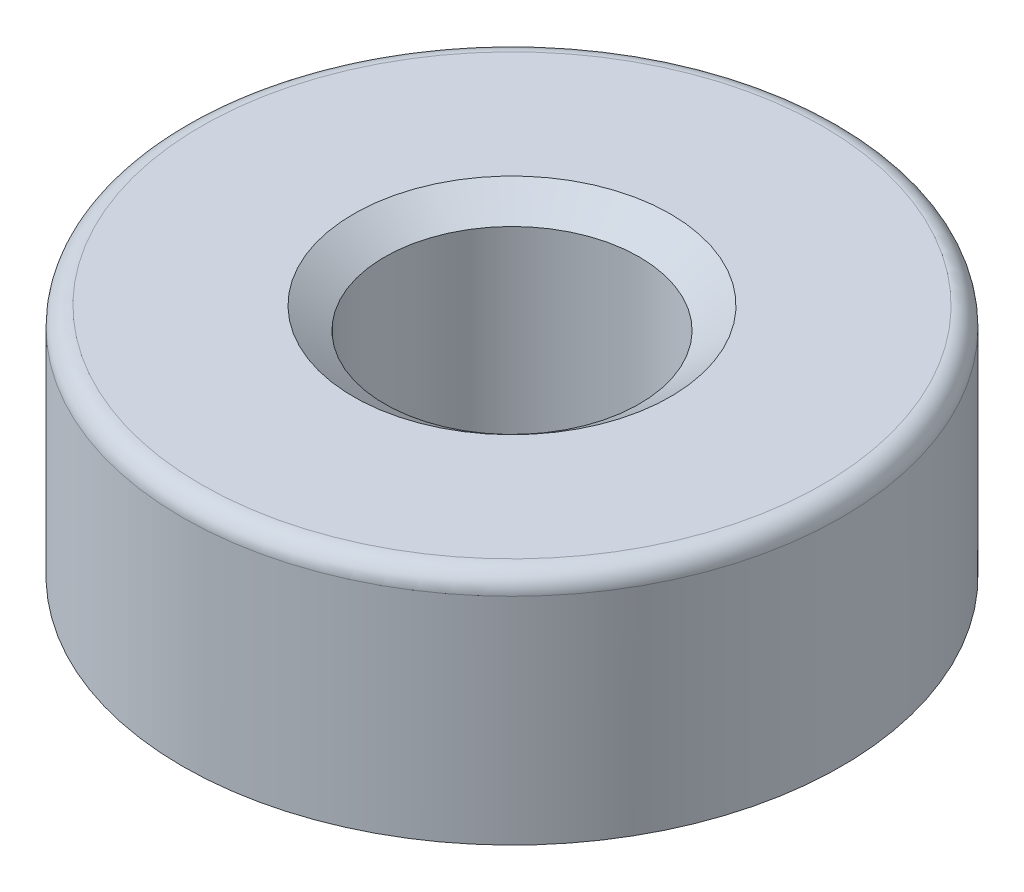
ISO-10303-21;
HEADER;
FILE_DESCRIPTION(('STEP AP214'),'2;1');
FILE_NAME('part.step','',(''),(''),'','','');
FILE_SCHEMA(('AUTOMOTIVE_DESIGN { 1 0 10303 214 1 1 1 1 }'));
ENDSEC;
DATA;
#1=APPLICATION_CONTEXT('core data for automotive mechanical design processes');
#2=APPLICATION_PROTOCOL_DEFINITION('international standard','automotive_design',2000,#1);
#3=PRODUCT_CONTEXT('',#1,'mechanical');
#4=PRODUCT('Part','Part','',(#3));
#5=PRODUCT_RELATED_PRODUCT_CATEGORY('part','',(#4));
#6=PRODUCT_DEFINITION_FORMATION('','',#4);
#7=PRODUCT_DEFINITION_CONTEXT('part definition',#1,'design');
#8=PRODUCT_DEFINITION('design','',#6,#7);
#9=PRODUCT_DEFINITION_SHAPE('','',#8);
#10=(LENGTH_UNIT() NAMED_UNIT(*) SI_UNIT(.MILLI.,.METRE.));
#11=(NAMED_UNIT(*) PLANE_ANGLE_UNIT() SI_UNIT($,.RADIAN.));
#12=(NAMED_UNIT(*) SI_UNIT($,.STERADIAN.) SOLID_ANGLE_UNIT());
#13=UNCERTAINTY_MEASURE_WITH_UNIT(LENGTH_MEASURE(1.E-05),#10,'distance_accuracy_value','');
#14=(GEOMETRIC_REPRESENTATION_CONTEXT(3) GLOBAL_UNCERTAINTY_ASSIGNED_CONTEXT((#13)) GLOBAL_UNIT_ASSIGNED_CONTEXT((#10,
#11,#12)) REPRESENTATION_CONTEXT('',''));
#15=CARTESIAN_POINT('',(0.,0.,0.));
#16=DIRECTION('',(0.,0.,1.));
#17=DIRECTION('',(1.,0.,0.));
#18=AXIS2_PLACEMENT_3D('',#15,#16,#17);
#19=CARTESIAN_POINT('',(0.,-0.6096,0.));
#20=DIRECTION('',(0.,1.,0.));
#21=DIRECTION('',(0.,0.,1.));
#22=AXIS2_PLACEMENT_3D('',#19,#20,#21);
#23=CONICAL_SURFACE('',#22,5.7370345,0.957964637348374);
#24=CARTESIAN_POINT('',(-4.13117819601966,-0.609799999999999,3.9804105306269));
#25=CARTESIAN_POINT('',(-4.20611833556658,-0.50848893755846,4.11021065984846));
#26=CARTESIAN_POINT('',(-4.28099927848266,-0.407003599605015,4.23990825749778));
#27=CARTESIAN_POINT('',(-4.43064275678402,-0.203684392061665,4.49909836493708));
#28=CARTESIAN_POINT('',(-4.50540529219188,-0.10185052253823,4.62859087476616));
#29=CARTESIAN_POINT('',(-4.58010863099149,0.000157622430637075,4.75798085306211));
#30=B_SPLINE_CURVE_WITH_KNOTS('',3,(#24,#25,#26,#27,#28,#29),.UNSPECIFIED.,.F.,.F.,(4,2,4),(0.,
0.542725590338056,1.08545107717376),.UNSPECIFIED.);
#31=CARTESIAN_POINT('',(-4.13132619390401,-0.609599999999999,3.98066687048199));
#32=VERTEX_POINT('',#31);
#33=CARTESIAN_POINT('',(-4.57999316093765,0.,4.75778085306211));
#34=VERTEX_POINT('',#33);
#35=EDGE_CURVE('E268',#32,#34,#30,.T.);
#36=ORIENTED_EDGE('',*,*,#35,.F.);
#37=CARTESIAN_POINT('',(0.,-0.6096,0.));
#38=DIRECTION('',(0.,-1.,0.));
#39=DIRECTION('',(0.,0.,-1.));
#40=AXIS2_PLACEMENT_3D('',#37,#38,#39);
#41=CIRCLE('',#40,5.7370345);
#42=CARTESIAN_POINT('',(-1.38169553688848,-0.6096,5.56816687048195));
#43=VERTEX_POINT('',#42);
#44=EDGE_CURVE('E209',#43,#32,#41,.T.);
#45=ORIENTED_EDGE('',*,*,#44,.F.);
#46=CARTESIAN_POINT('',(-1.83047797397597,0.000157622430635324,6.34548085306206));
#47=CARTESIAN_POINT('',(-1.75577463517636,-0.101850522538232,6.21609087476611));
#48=CARTESIAN_POINT('',(-1.6810120997685,-0.203684392061666,6.08659836493703));
#49=CARTESIAN_POINT('',(-1.53136862146714,-0.407003599605016,5.82740825749774));
#50=CARTESIAN_POINT('',(-1.45648767855105,-0.50848893755846,5.69771065984841));
#51=CARTESIAN_POINT('',(-1.38154753900413,-0.6098,5.56791053062685));
#52=B_SPLINE_CURVE_WITH_KNOTS('',3,(#46,#47,#48,#49,#50,#51),.UNSPECIFIED.,.F.,.F.,(4,2,4),(0.,
0.542725486835704,1.08545107717376),.UNSPECIFIED.);
#53=CARTESIAN_POINT('',(-1.83036250392213,0.,6.34528085306206));
#54=VERTEX_POINT('',#53);
#55=EDGE_CURVE('E183',#54,#43,#52,.T.);
#56=ORIENTED_EDGE('',*,*,#55,.F.);
#57=CARTESIAN_POINT('',(0.,0.,0.));
#58=DIRECTION('',(0.,-1.,0.));
#59=DIRECTION('',(0.,0.,-1.));
#60=AXIS2_PLACEMENT_3D('',#57,#58,#59);
#61=CIRCLE('',#60,6.604);
#62=EDGE_CURVE('E140',#54,#34,#61,.T.);
#63=ORIENTED_EDGE('',*,*,#62,.T.);
#64=EDGE_LOOP('',(#36,#45,#56,#63));
#65=FACE_BOUND('',#64,.T.);
#66=ADVANCED_FACE('F33',(#65),#23,.T.);
#67=CARTESIAN_POINT('',(0.,0.,0.));
#68=DIRECTION('',(0.,-1.,0.));
#69=DIRECTION('',(0.,0.,-1.));
#70=AXIS2_PLACEMENT_3D('',#67,#68,#69);
#71=CONICAL_SURFACE('',#70,4.8674655,0.959374761459782);
#72=CARTESIAN_POINT('',(-3.67535542500938,0.000153044537294077,3.19090233199023));
#73=CARTESIAN_POINT('',(-3.71346949554331,-0.0503643154175214,3.25691783863826));
#74=CARTESIAN_POINT('',(-3.75155322815625,-0.100973127363491,3.32288079846576));
#75=CARTESIAN_POINT('',(-3.8276665504516,-0.202352777514972,3.45471293981417));
#76=CARTESIAN_POINT('',(-3.8656961403259,-0.253123615144149,3.52058212166745));
#77=CARTESIAN_POINT('',(-3.94170795018969,-0.354806757262533,3.65223843832681));
#78=CARTESIAN_POINT('',(-3.97969017021732,-0.405719061637743,3.71802557319892));
#79=CARTESIAN_POINT('',(-4.05561262298329,-0.507669333969212,3.84952711882485));
#80=CARTESIAN_POINT('',(-4.09355285557214,-0.55870730237083,3.91524152931971));
#81=CARTESIAN_POINT('',(-4.13147463561528,-0.609800000000001,3.98092397906788));
#82=B_SPLINE_CURVE_WITH_KNOTS('',3,(#72,#73,#74,#75,#76,#77,#78,#79,#80,#81),.UNSPECIFIED.,.F.,
.F.,(4,2,2,2,4),(0.,0.274343792573355,0.548686610376872,0.823029207175311,1.09737277766191),.UNSPECIFIED.);
#83=CARTESIAN_POINT('',(-3.67547089506321,0.,3.19110233199023));
#84=VERTEX_POINT('',#83);
#85=EDGE_CURVE('E133',#84,#32,#82,.T.);
#86=ORIENTED_EDGE('',*,*,#85,.F.);
#87=CARTESIAN_POINT('',(0.,0.,0.));
#88=DIRECTION('',(0.,-1.,0.));
#89=DIRECTION('',(0.,0.,-1.));
#90=AXIS2_PLACEMENT_3D('',#87,#88,#89);
#91=CIRCLE('',#90,4.8674655);
#92=CARTESIAN_POINT('',(-0.925840238047673,0.,4.77860233199019));
#93=VERTEX_POINT('',#92);
#94=EDGE_CURVE('E214',#93,#84,#91,.T.);
#95=ORIENTED_EDGE('',*,*,#94,.F.);
#96=CARTESIAN_POINT('',(-1.38184397859975,-0.6098,5.56842397906783));
#97=CARTESIAN_POINT('',(-1.34392219855661,-0.558707302370829,5.50274152931966));
#98=CARTESIAN_POINT('',(-1.30598196596776,-0.507669333969211,5.4370271188248));
#99=CARTESIAN_POINT('',(-1.23005951320178,-0.405719061637743,5.30552557319888));
#100=CARTESIAN_POINT('',(-1.19207729317415,-0.354806757262532,5.23973843832676));
#101=CARTESIAN_POINT('',(-1.11606548331036,-0.253123615144149,5.10808212166741));
#102=CARTESIAN_POINT('',(-1.07803589343606,-0.202352777514972,5.04221293981413));
#103=CARTESIAN_POINT('',(-1.00192257114072,-0.100973127363492,4.91038079846572));
#104=CARTESIAN_POINT('',(-0.963838838527767,-0.0503643154175219,4.84441783863822));
#105=CARTESIAN_POINT('',(-0.925724767993835,0.000153044537293294,4.77840233199019));
#106=B_SPLINE_CURVE_WITH_KNOTS('',3,(#96,#97,#98,#99,#100,#101,#102,#103,#104,#105),
.UNSPECIFIED.,.F.,.F.,(4,2,2,2,4),(0.,0.274343570486602,0.54868616728504,0.823028985088557,
1.09737277766191),.UNSPECIFIED.);
#107=EDGE_CURVE('E147',#43,#93,#106,.T.);
#108=ORIENTED_EDGE('',*,*,#107,.F.);
#109=ORIENTED_EDGE('',*,*,#44,.T.);
#110=EDGE_LOOP('',(#86,#95,#108,#109));
#111=FACE_BOUND('',#110,.T.);
#112=ADVANCED_FACE('F242',(#111),#71,.F.);
#113=CARTESIAN_POINT('',(-4.58010863099155,0.000157622430634788,-4.75798085306204));
#114=CARTESIAN_POINT('',(-4.50540529219194,-0.101850522538232,-4.6285908747661));
#115=CARTESIAN_POINT('',(-4.43064275678408,-0.203684392061667,-4.49909836493702));
#116=CARTESIAN_POINT('',(-4.28099927848272,-0.407003599605016,-4.23990825749772));
#117=CARTESIAN_POINT('',(-4.20611833556663,-0.50848893755846,-4.1102106598484));
#118=CARTESIAN_POINT('',(-4.13117819601972,-0.609799999999999,-3.98041053062684));
#119=B_SPLINE_CURVE_WITH_KNOTS('',3,(#113,#114,#115,#116,#117,#118),.UNSPECIFIED.,.F.,.F.,(4,2,
4),(0.,0.542725486835703,1.08545107717376),.UNSPECIFIED.);
#120=CARTESIAN_POINT('',(-4.57999316093771,0.,-4.75778085306204));
#121=VERTEX_POINT('',#120);
#122=CARTESIAN_POINT('',(-4.13132619390406,-0.6096,-3.98066687048194));
#123=VERTEX_POINT('',#122);
#124=EDGE_CURVE('E121',#121,#123,#119,.T.);
#125=ORIENTED_EDGE('',*,*,#124,.F.);
#126=CARTESIAN_POINT('',(-1.83036250392213,0.,-6.34528085306206));
#127=VERTEX_POINT('',#126);
#128=EDGE_CURVE('E130',#121,#127,#61,.T.);
#129=ORIENTED_EDGE('',*,*,#128,.T.);
#130=CARTESIAN_POINT('',(-1.38154753900413,-0.6098,-5.56791053062685));
#131=CARTESIAN_POINT('',(-1.45648767855105,-0.50848893755846,-5.69771065984841));
#132=CARTESIAN_POINT('',(-1.53136862146714,-0.407003599605016,-5.82740825749774));
#133=CARTESIAN_POINT('',(-1.6810120997685,-0.203684392061665,-6.08659836493703));
#134=CARTESIAN_POINT('',(-1.75577463517636,-0.101850522538231,-6.21609087476611));
#135=CARTESIAN_POINT('',(-1.83047797397597,0.000157622430637036,-6.34548085306206));
#136=B_SPLINE_CURVE_WITH_KNOTS('',3,(#130,#131,#132,#133,#134,#135),.UNSPECIFIED.,.F.,.F.,(4,2,
4),(0.,0.542725590338057,1.08545107717376),.UNSPECIFIED.);
#137=CARTESIAN_POINT('',(-1.38169553688848,-0.6096,-5.56816687048195));
#138=VERTEX_POINT('',#137);
#139=EDGE_CURVE('E263',#138,#127,#136,.T.);
#140=ORIENTED_EDGE('',*,*,#139,.F.);
#141=EDGE_CURVE('E132',#123,#138,#41,.T.);
#142=ORIENTED_EDGE('',*,*,#141,.F.);
#143=EDGE_LOOP('',(#125,#129,#140,#142));
#144=FACE_BOUND('',#143,.T.);
#145=ADVANCED_FACE('F128',(#144),#23,.T.);
#146=CARTESIAN_POINT('',(-4.13147463561533,-0.6098,-3.98092397906782));
#147=CARTESIAN_POINT('',(-4.09355285557219,-0.558707302370829,-3.91524152931965));
#148=CARTESIAN_POINT('',(-4.05561262298335,-0.507669333969211,-3.84952711882479));
#149=CARTESIAN_POINT('',(-3.97969017021737,-0.405719061637743,-3.71802557319887));
#150=CARTESIAN_POINT('',(-3.94170795018974,-0.354806757262532,-3.65223843832675));
#151=CARTESIAN_POINT('',(-3.86569614032594,-0.253123615144149,-3.5205821216674));
#152=CARTESIAN_POINT('',(-3.82766655045165,-0.202352777514972,-3.45471293981411));
#153=CARTESIAN_POINT('',(-3.7515532281563,-0.100973127363491,-3.3228807984657));
#154=CARTESIAN_POINT('',(-3.71346949554335,-0.0503643154175213,-3.25691783863821));
#155=CARTESIAN_POINT('',(-3.67535542500942,0.000153044537294263,-3.19090233199018));
#156=B_SPLINE_CURVE_WITH_KNOTS('',3,(#146,#147,#148,#149,#150,#151,#152,#153,#154,#155),
.UNSPECIFIED.,.F.,.F.,(4,2,2,2,4),(0.,0.274343570486603,0.548686167285041,0.823028985088558,
1.09737277766191),.UNSPECIFIED.);
#157=CARTESIAN_POINT('',(-3.67547089506326,0.,-3.19110233199018));
#158=VERTEX_POINT('',#157);
#159=EDGE_CURVE('E123',#123,#158,#156,.T.);
#160=ORIENTED_EDGE('',*,*,#159,.F.);
#161=ORIENTED_EDGE('',*,*,#141,.T.);
#162=CARTESIAN_POINT('',(-0.925724767993835,0.000153044537293486,-4.77840233199019));
#163=CARTESIAN_POINT('',(-0.963838838527767,-0.0503643154175216,-4.84441783863822));
#164=CARTESIAN_POINT('',(-1.00192257114071,-0.100973127363491,-4.91038079846572));
#165=CARTESIAN_POINT('',(-1.07803589343606,-0.202352777514972,-5.04221293981412));
#166=CARTESIAN_POINT('',(-1.11606548331036,-0.253123615144149,-5.10808212166741));
#167=CARTESIAN_POINT('',(-1.19207729317415,-0.354806757262532,-5.23973843832676));
#168=CARTESIAN_POINT('',(-1.23005951320178,-0.405719061637743,-5.30552557319888));
#169=CARTESIAN_POINT('',(-1.30598196596776,-0.507669333969211,-5.4370271188248));
#170=CARTESIAN_POINT('',(-1.34392219855661,-0.558707302370829,-5.50274152931966));
#171=CARTESIAN_POINT('',(-1.38184397859975,-0.6098,-5.56842397906783));
#172=B_SPLINE_CURVE_WITH_KNOTS('',3,(#162,#163,#164,#165,#166,#167,#168,#169,#170,#171),
.UNSPECIFIED.,.F.,.F.,(4,2,2,2,4),(0.,0.274343792573353,0.54868661037687,0.823029207175308,
1.09737277766191),.UNSPECIFIED.);
#173=CARTESIAN_POINT('',(-0.925840238047673,0.,-4.77860233199019));
#174=VERTEX_POINT('',#173);
#175=EDGE_CURVE('E12',#174,#138,#172,.T.);
#176=ORIENTED_EDGE('',*,*,#175,.F.);
#177=EDGE_CURVE('E217',#158,#174,#91,.T.);
#178=ORIENTED_EDGE('',*,*,#177,.F.);
#179=EDGE_LOOP('',(#160,#161,#176,#178));
#180=FACE_BOUND('',#179,.T.);
#181=ADVANCED_FACE('F248',(#180),#71,.F.);
#182=CARTESIAN_POINT('',(8.88359413195526,1.70183097655833,-1.5875));
#183=CARTESIAN_POINT('',(8.62766235007396,1.52469212498835,-1.5875));
#184=CARTESIAN_POINT('',(8.37162948069224,1.34769885013557,-1.5875));
#185=CARTESIAN_POINT('',(7.85927634395191,0.994136258998819,-1.5875));
#186=CARTESIAN_POINT('',(7.60295608052589,0.817566937015043,-1.5875));
#187=CARTESIAN_POINT('',(7.08997105135558,0.465004338070332,-1.5875));
#188=CARTESIAN_POINT('',(6.83330633744547,0.289010985726122,-1.5875));
#189=CARTESIAN_POINT('',(6.31945101554129,-0.0622159179651071,-1.5875));
#190=CARTESIAN_POINT('',(6.0622603991041,-0.237449456970467,-1.5875));
#191=CARTESIAN_POINT('',(5.54708808050595,-0.586858049222113,-1.5875));
#192=CARTESIAN_POINT('',(5.2891062349854,-0.761032891229834,-1.5875));
#193=CARTESIAN_POINT('',(4.77205723985228,-1.10774785422472,-1.5875));
#194=CARTESIAN_POINT('',(4.51299013197585,-1.2802880372589,-1.5875));
#195=CARTESIAN_POINT('',(4.12306667969058,-1.53714244357691,-1.5875));
#196=CARTESIAN_POINT('',(3.9928600242795,-1.62244214357263,-1.5875));
#197=CARTESIAN_POINT('',(3.73188216948657,-1.79216931768247,-1.5875));
#198=CARTESIAN_POINT('',(3.60111097963224,-1.87659680643574,-1.5875));
#199=CARTESIAN_POINT('',(3.33881666890665,-2.04431754192365,-1.5875));
#200=CARTESIAN_POINT('',(3.20729345266764,-2.12761064005899,-1.5875));
#201=CARTESIAN_POINT('',(2.94322406483998,-2.29257431796486,-1.5875));
#202=CARTESIAN_POINT('',(2.81067783395692,-2.37424480269237,-1.5875));
#203=CARTESIAN_POINT('',(2.67748382748673,-2.45486052485991,-1.5875));
#204=B_SPLINE_CURVE_WITH_KNOTS('',3,(#182,#183,#184,#185,#186,#187,#188,#189,#190,#191,#192,
#193,#194,#195,#196,#197,#198,#199,#200,#201,#202,#203),.UNSPECIFIED.,.F.,.F.,(4,2,2,2,2,2,2,2,
2,2,4),(0.,0.933763312908904,1.86751400081132,2.80113715565333,3.73477541896571,
4.66859422558676,5.60237744393722,6.06935260293879,6.53631991147511,7.00334781307664,
7.47040299021021),.UNSPECIFIED.);
#205=CARTESIAN_POINT('',(6.41035566485979,0.,-1.5875));
#206=VERTEX_POINT('',#205);
#207=CARTESIAN_POINT('',(5.51302173079249,-0.6096,-1.5875));
#208=VERTEX_POINT('',#207);
#209=EDGE_CURVE('E259',#206,#208,#204,.T.);
#210=ORIENTED_EDGE('',*,*,#209,.F.);
#211=CARTESIAN_POINT('',(6.41035566485979,0.,1.5875));
#212=VERTEX_POINT('',#211);
#213=EDGE_CURVE('E141',#206,#212,#61,.T.);
#214=ORIENTED_EDGE('',*,*,#213,.T.);
#215=CARTESIAN_POINT('',(2.67748382748673,-2.45486052485992,1.5875));
#216=CARTESIAN_POINT('',(2.81067783395692,-2.37424480269237,1.5875));
#217=CARTESIAN_POINT('',(2.94322406483998,-2.29257431796486,1.5875));
#218=CARTESIAN_POINT('',(3.20729345266764,-2.12761064005899,1.5875));
#219=CARTESIAN_POINT('',(3.33881666890665,-2.04431754192365,1.5875));
#220=CARTESIAN_POINT('',(3.60111097963224,-1.87659680643574,1.5875));
#221=CARTESIAN_POINT('',(3.73188216948657,-1.79216931768247,1.5875));
#222=CARTESIAN_POINT('',(3.9928600242795,-1.62244214357263,1.5875));
#223=CARTESIAN_POINT('',(4.12306667969058,-1.53714244357691,1.5875));
#224=CARTESIAN_POINT('',(4.51299013197585,-1.2802880372589,1.5875));
#225=CARTESIAN_POINT('',(4.77205723985229,-1.10774785422472,1.5875));
#226=CARTESIAN_POINT('',(5.28910623498541,-0.761032891229833,1.5875));
#227=CARTESIAN_POINT('',(5.54708808050595,-0.586858049222112,1.5875));
#228=CARTESIAN_POINT('',(6.0622603991041,-0.237449456970466,1.5875));
#229=CARTESIAN_POINT('',(6.31945101554129,-0.0622159179651071,1.5875));
#230=CARTESIAN_POINT('',(6.83330633744547,0.289010985726122,1.5875));
#231=CARTESIAN_POINT('',(7.08997105135558,0.465004338070332,1.5875));
#232=CARTESIAN_POINT('',(7.60295608052589,0.817566937015044,1.5875));
#233=CARTESIAN_POINT('',(7.85927634395191,0.99413625899882,1.5875));
#234=CARTESIAN_POINT('',(8.37162948069224,1.34769885013557,1.5875));
#235=CARTESIAN_POINT('',(8.62766235007396,1.52469212498835,1.5875));
#236=CARTESIAN_POINT('',(8.88359413195526,1.70183097655833,1.5875));
#237=B_SPLINE_CURVE_WITH_KNOTS('',3,(#215,#216,#217,#218,#219,#220,#221,#222,#223,#224,#225,
#226,#227,#228,#229,#230,#231,#232,#233,#234,#235,#236),.UNSPECIFIED.,.F.,.F.,(4,2,2,2,2,2,2,2,
2,2,4),(0.,0.467055177133574,0.934083078735098,1.40105038727142,1.868025546273,2.80180876462346,
3.73562757124451,4.66926583455689,5.60288898939889,6.53663967730131,7.47040299021021),.UNSPECIFIED.);
#238=CARTESIAN_POINT('',(5.51302173079249,-0.6096,1.5875));
#239=VERTEX_POINT('',#238);
#240=EDGE_CURVE('E189',#239,#212,#237,.T.);
#241=ORIENTED_EDGE('',*,*,#240,.F.);
#242=EDGE_CURVE('E213',#208,#239,#41,.T.);
#243=ORIENTED_EDGE('',*,*,#242,.F.);
#244=EDGE_LOOP('',(#210,#214,#241,#243));
#245=FACE_BOUND('',#244,.T.);
#246=ADVANCED_FACE('F35',(#245),#23,.T.);
#247=CARTESIAN_POINT('',(0.,0.,0.));
#248=DIRECTION('',(0.,-1.,0.));
#249=DIRECTION('',(0.,0.,-1.));
#250=AXIS2_PLACEMENT_3D('',#247,#248,#249);
#251=CYLINDRICAL_SURFACE('',#250,6.604);
#252=CARTESIAN_POINT('',(0.,4.318,0.));
#253=DIRECTION('',(0.,-1.,0.));
#254=DIRECTION('',(0.,0.,-1.));
#255=AXIS2_PLACEMENT_3D('',#252,#253,#254);
#256=CIRCLE('',#255,6.604);
#257=CARTESIAN_POINT('',(0.,4.318,-6.604));
#258=VERTEX_POINT('',#257);
#259=EDGE_CURVE('E144',#258,#258,#256,.T.);
#260=ORIENTED_EDGE('',*,*,#259,.T.);
#261=EDGE_LOOP('',(#260));
#262=FACE_BOUND('',#261,.T.);
#263=EDGE_CURVE('E143',#212,#54,#61,.T.);
#264=ORIENTED_EDGE('',*,*,#263,.F.);
#265=ORIENTED_EDGE('',*,*,#213,.F.);
#266=CARTESIAN_POINT('',(0.,0.,0.));
#267=DIRECTION('',(0.,1.,0.));
#268=DIRECTION('',(0.866025403784436,0.,-0.500000000000004));
#269=AXIS2_PLACEMENT_3D('',#266,#267,#268);
#270=CIRCLE('',#269,6.604);
#271=EDGE_CURVE('E139',#206,#127,#270,.T.);
#272=ORIENTED_EDGE('',*,*,#271,.T.);
#273=ORIENTED_EDGE('',*,*,#128,.F.);
#274=CARTESIAN_POINT('',(0.,0.,0.));
#275=DIRECTION('',(0.,1.,0.));
#276=DIRECTION('',(-0.866025403784443,0.,-0.499999999999992));
#277=AXIS2_PLACEMENT_3D('',#274,#275,#276);
#278=CIRCLE('',#277,6.604);
#279=EDGE_CURVE('E108',#121,#34,#278,.T.);
#280=ORIENTED_EDGE('',*,*,#279,.T.);
#281=ORIENTED_EDGE('',*,*,#62,.F.);
#282=EDGE_LOOP('',(#264,#265,#272,#273,#280,#281));
#283=FACE_BOUND('',#282,.T.);
#284=ADVANCED_FACE('F137',(#262,#283),#251,.T.);
#285=CARTESIAN_POINT('',(0.,4.318,0.));
#286=DIRECTION('',(0.,-1.,0.));
#287=DIRECTION('',(0.,0.,-1.));
#288=AXIS2_PLACEMENT_3D('',#285,#286,#287);
#289=TOROIDAL_SURFACE('',#288,6.223,0.381);
#290=CARTESIAN_POINT('',(0.,4.699,0.));
#291=DIRECTION('',(0.,-1.,0.));
#292=DIRECTION('',(0.,0.,-1.));
#293=AXIS2_PLACEMENT_3D('',#290,#291,#292);
#294=CIRCLE('',#293,6.223);
#295=CARTESIAN_POINT('',(0.,4.699,-6.223));
#296=VERTEX_POINT('',#295);
#297=EDGE_CURVE('E223',#296,#296,#294,.T.);
#298=ORIENTED_EDGE('',*,*,#297,.T.);
#299=EDGE_LOOP('',(#298));
#300=FACE_BOUND('',#299,.T.);
#301=ORIENTED_EDGE('',*,*,#259,.F.);
#302=EDGE_LOOP('',(#301));
#303=FACE_BOUND('',#302,.T.);
#304=ADVANCED_FACE('F229',(#300,#303),#289,.T.);
#305=CARTESIAN_POINT('',(6.223,4.699,0.));
#306=DIRECTION('',(0.,1.,0.));
#307=DIRECTION('',(0.,0.,1.));
#308=AXIS2_PLACEMENT_3D('',#305,#306,#307);
#309=PLANE('',#308);
#310=CARTESIAN_POINT('',(0.,4.699,0.));
#311=DIRECTION('',(0.,-1.,0.));
#312=DIRECTION('',(0.,0.,-1.));
#313=AXIS2_PLACEMENT_3D('',#310,#311,#312);
#314=CIRCLE('',#313,3.175);
#315=CARTESIAN_POINT('',(0.,4.699,-3.175));
#316=VERTEX_POINT('',#315);
#317=EDGE_CURVE('E200',#316,#316,#314,.T.);
#318=ORIENTED_EDGE('',*,*,#317,.T.);
#319=EDGE_LOOP('',(#318));
#320=FACE_BOUND('',#319,.T.);
#321=ORIENTED_EDGE('',*,*,#297,.F.);
#322=EDGE_LOOP('',(#321));
#323=FACE_BOUND('',#322,.T.);
#324=ADVANCED_FACE('F231',(#320,#323),#309,.T.);
#325=CARTESIAN_POINT('',(0.,0.,0.));
#326=DIRECTION('',(0.,-1.,0.));
#327=DIRECTION('',(0.,0.,-1.));
#328=AXIS2_PLACEMENT_3D('',#325,#326,#327);
#329=CYLINDRICAL_SURFACE('',#328,2.5527);
#330=CARTESIAN_POINT('',(0.,4.26342269239784,0.));
#331=DIRECTION('',(0.,-1.,0.));
#332=DIRECTION('',(0.,0.,-1.));
#333=AXIS2_PLACEMENT_3D('',#330,#331,#332);
#334=CIRCLE('',#333,2.5527);
#335=CARTESIAN_POINT('',(0.,4.26342269239784,-2.5527));
#336=VERTEX_POINT('',#335);
#337=EDGE_CURVE('E197',#336,#336,#334,.T.);
#338=ORIENTED_EDGE('',*,*,#337,.F.);
#339=EDGE_LOOP('',(#338));
#340=FACE_BOUND('',#339,.T.);
#341=CARTESIAN_POINT('',(0.,-0.52962269239784,0.));
#342=DIRECTION('',(0.,-1.,0.));
#343=DIRECTION('',(0.,0.,-1.));
#344=AXIS2_PLACEMENT_3D('',#341,#342,#343);
#345=CIRCLE('',#344,2.5527);
#346=CARTESIAN_POINT('',(0.,-0.52962269239784,-2.5527));
#347=VERTEX_POINT('',#346);
#348=EDGE_CURVE('E203',#347,#347,#345,.T.);
#349=ORIENTED_EDGE('',*,*,#348,.T.);
#350=EDGE_LOOP('',(#349));
#351=FACE_BOUND('',#350,.T.);
#352=ADVANCED_FACE('F238',(#340,#351),#329,.F.);
#353=CARTESIAN_POINT('',(2.5527,-1.2192,0.));
#354=DIRECTION('',(0.,-1.,0.));
#355=DIRECTION('',(0.,0.,-1.));
#356=AXIS2_PLACEMENT_3D('',#353,#354,#355);
#357=PLANE('',#356);
#358=CARTESIAN_POINT('',(0.,-1.2192,0.));
#359=DIRECTION('',(0.,-1.,0.));
#360=DIRECTION('',(0.,0.,-1.));
#361=AXIS2_PLACEMENT_3D('',#358,#359,#360);
#362=CIRCLE('',#361,3.175);
#363=CARTESIAN_POINT('',(0.,-1.2192,-3.175));
#364=VERTEX_POINT('',#363);
#365=EDGE_CURVE('E162',#364,#364,#362,.T.);
#366=ORIENTED_EDGE('',*,*,#365,.F.);
#367=EDGE_LOOP('',(#366));
#368=FACE_BOUND('',#367,.T.);
#369=CARTESIAN_POINT('',(0.,-1.2192,0.));
#370=DIRECTION('',(0.,-1.,0.));
#371=DIRECTION('',(0.,0.,-1.));
#372=AXIS2_PLACEMENT_3D('',#369,#370,#371);
#373=CIRCLE('',#372,4.0005);
#374=CARTESIAN_POINT('',(0.,-1.2192,-4.0005));
#375=VERTEX_POINT('',#374);
#376=EDGE_CURVE('E220',#375,#375,#373,.T.);
#377=ORIENTED_EDGE('',*,*,#376,.T.);
#378=EDGE_LOOP('',(#377));
#379=FACE_BOUND('',#378,.T.);
#380=ADVANCED_FACE('F307',(#368,#379),#357,.T.);
#381=CARTESIAN_POINT('',(0.,0.,0.));
#382=DIRECTION('',(0.,-1.,0.));
#383=DIRECTION('',(0.,0.,-1.));
#384=AXIS2_PLACEMENT_3D('',#381,#382,#383);
#385=CYLINDRICAL_SURFACE('',#384,4.0005);
#386=CARTESIAN_POINT('',(0.,0.,0.));
#387=DIRECTION('',(0.,-1.,0.));
#388=DIRECTION('',(0.,0.,-1.));
#389=AXIS2_PLACEMENT_3D('',#386,#387,#388);
#390=CIRCLE('',#389,4.0005);
#391=CARTESIAN_POINT('',(0.,0.,-4.0005));
#392=VERTEX_POINT('',#391);
#393=EDGE_CURVE('E216',#392,#392,#390,.T.);
#394=ORIENTED_EDGE('',*,*,#393,.T.);
#395=EDGE_LOOP('',(#394));
#396=FACE_BOUND('',#395,.T.);
#397=ORIENTED_EDGE('',*,*,#376,.F.);
#398=EDGE_LOOP('',(#397));
#399=FACE_BOUND('',#398,.T.);
#400=ADVANCED_FACE('F310',(#396,#399),#385,.T.);
#401=CARTESIAN_POINT('',(4.0005,0.,0.));
#402=DIRECTION('',(0.,-1.,0.));
#403=DIRECTION('',(0.,0.,-1.));
#404=AXIS2_PLACEMENT_3D('',#401,#402,#403);
#405=PLANE('',#404);
#406=ORIENTED_EDGE('',*,*,#94,.T.);
#407=DIRECTION('',(0.499999999999992,0.,-0.866025403784443));
#408=VECTOR('',#407,1.);
#409=CARTESIAN_POINT('',(-3.67547089506321,0.,3.19110233199023));
#410=LINE('',#409,#408);
#411=EDGE_CURVE('E112',#34,#84,#410,.T.);
#412=ORIENTED_EDGE('',*,*,#411,.F.);
#413=ORIENTED_EDGE('',*,*,#279,.F.);
#414=DIRECTION('',(-0.500000000000004,0.,-0.866025403784436));
#415=VECTOR('',#414,1.);
#416=CARTESIAN_POINT('',(-3.67547089506326,0.,-3.19110233199018));
#417=LINE('',#416,#415);
#418=EDGE_CURVE('E54',#158,#121,#417,.T.);
#419=ORIENTED_EDGE('',*,*,#418,.F.);
#420=ORIENTED_EDGE('',*,*,#177,.T.);
#421=DIRECTION('',(0.500000000000004,0.,0.866025403784436));
#422=VECTOR('',#421,1.);
#423=CARTESIAN_POINT('',(-0.925840238047673,0.,-4.77860233199019));
#424=LINE('',#423,#422);
#425=EDGE_CURVE('E264',#127,#174,#424,.T.);
#426=ORIENTED_EDGE('',*,*,#425,.F.);
#427=ORIENTED_EDGE('',*,*,#271,.F.);
#428=DIRECTION('',(1.,0.,0.));
#429=VECTOR('',#428,1.);
#430=CARTESIAN_POINT('',(4.60131113311089,0.,-1.5875));
#431=LINE('',#430,#429);
#432=CARTESIAN_POINT('',(4.60131113311089,0.,-1.5875));
#433=VERTEX_POINT('',#432);
#434=EDGE_CURVE('E61',#433,#206,#431,.T.);
#435=ORIENTED_EDGE('',*,*,#434,.F.);
#436=CARTESIAN_POINT('',(4.60131113311089,0.,1.5875));
#437=VERTEX_POINT('',#436);
#438=EDGE_CURVE('E212',#433,#437,#91,.T.);
#439=ORIENTED_EDGE('',*,*,#438,.T.);
#440=DIRECTION('',(-1.,0.,0.));
#441=VECTOR('',#440,1.);
#442=CARTESIAN_POINT('',(4.60131113311089,0.,1.5875));
#443=LINE('',#442,#441);
#444=EDGE_CURVE('E190',#212,#437,#443,.T.);
#445=ORIENTED_EDGE('',*,*,#444,.F.);
#446=ORIENTED_EDGE('',*,*,#263,.T.);
#447=DIRECTION('',(-0.500000000000004,0.,0.866025403784436));
#448=VECTOR('',#447,1.);
#449=CARTESIAN_POINT('',(-0.925840238047673,0.,4.77860233199019));
#450=LINE('',#449,#448);
#451=EDGE_CURVE('E269',#93,#54,#450,.T.);
#452=ORIENTED_EDGE('',*,*,#451,.F.);
#453=EDGE_LOOP('',(#406,#412,#413,#419,#420,#426,#427,#435,#439,#445,#446,#452));
#454=FACE_BOUND('',#453,.T.);
#455=ORIENTED_EDGE('',*,*,#393,.F.);
#456=EDGE_LOOP('',(#455));
#457=FACE_BOUND('',#456,.T.);
#458=ADVANCED_FACE('F110',(#454,#457),#405,.T.);
#459=CARTESIAN_POINT('',(7.21485407767053,-1.7665955167632,-1.5875));
#460=CARTESIAN_POINT('',(7.03974524876197,-1.64671176503557,-1.5875));
#461=CARTESIAN_POINT('',(6.86454774778282,-1.5269571696154,-1.5875));
#462=CARTESIAN_POINT('',(6.51391694349854,-1.28779133053037,-1.5875));
#463=CARTESIAN_POINT('',(6.33848363869295,-1.16838008906566,-1.5875));
#464=CARTESIAN_POINT('',(5.98734282383478,-0.92999962809926,-1.5875));
#465=CARTESIAN_POINT('',(5.81163534341483,-0.811030364971397,-1.5875));
#466=CARTESIAN_POINT('',(5.45984461983842,-0.573649364322018,-1.5875));
#467=CARTESIAN_POINT('',(5.28376137762757,-0.455237625399887,-1.5875));
#468=CARTESIAN_POINT('',(4.9310810019884,-0.21913688560499,-1.5875));
#469=CARTESIAN_POINT('',(4.75448381143613,-0.101447969975989,-1.5875));
#470=CARTESIAN_POINT('',(4.4006274843647,0.132924997282341,-1.5875));
#471=CARTESIAN_POINT('',(4.22336835885226,0.24960906551466,-1.5875));
#472=CARTESIAN_POINT('',(3.86791031163845,0.481582514859256,-1.5875));
#473=CARTESIAN_POINT('',(3.68971129247786,0.596871747087129,-1.5875));
#474=CARTESIAN_POINT('',(3.42141228370587,0.76825142627634,-1.5875));
#475=CARTESIAN_POINT('',(3.33181003975289,0.825120510636639,-1.5875));
#476=CARTESIAN_POINT('',(3.15219233234619,0.938205499756766,-1.5875));
#477=CARTESIAN_POINT('',(3.06217686163531,0.994421392983455,-1.5875));
#478=CARTESIAN_POINT('',(2.97191568508043,1.05024267880496,-1.5875));
#479=B_SPLINE_CURVE_WITH_KNOTS('',3,(#459,#460,#461,#462,#463,#464,#465,#466,#467,#468,#469,
#470,#471,#472,#473,#474,#475,#476,#477,#478),.UNSPECIFIED.,.F.,.F.,(4,2,2,2,2,2,2,2,2,4),(0.,
0.636645317122332,1.27329470469245,1.90987948583049,2.54646266688254,3.18311953273302,
3.81976585890572,4.45647955140419,4.77485402560561,5.0932341127037),.UNSPECIFIED.);
#480=EDGE_CURVE('E47',#208,#433,#479,.T.);
#481=ORIENTED_EDGE('',*,*,#480,.F.);
#482=ORIENTED_EDGE('',*,*,#242,.T.);
#483=CARTESIAN_POINT('',(2.97191568508042,1.05024267880496,1.5875));
#484=CARTESIAN_POINT('',(3.06217686163531,0.994421392983458,1.5875));
#485=CARTESIAN_POINT('',(3.15219233234619,0.938205499756769,1.5875));
#486=CARTESIAN_POINT('',(3.33181003975289,0.825120510636642,1.5875));
#487=CARTESIAN_POINT('',(3.42141228370587,0.768251426276342,1.5875));
#488=CARTESIAN_POINT('',(3.68971129247785,0.596871747087131,1.5875));
#489=CARTESIAN_POINT('',(3.86791031163845,0.48158251485926,1.5875));
#490=CARTESIAN_POINT('',(4.22336835885226,0.249609065514661,1.5875));
#491=CARTESIAN_POINT('',(4.40062748436469,0.132924997282337,1.5875));
#492=CARTESIAN_POINT('',(4.75448381143613,-0.101447969975982,1.5875));
#493=CARTESIAN_POINT('',(4.93108100198841,-0.219136885604969,1.5875));
#494=CARTESIAN_POINT('',(5.28376137762758,-0.455237625399867,1.5875));
#495=CARTESIAN_POINT('',(5.45984461983842,-0.573649364322012,1.5875));
#496=CARTESIAN_POINT('',(5.81163534341482,-0.811030364971402,1.5875));
#497=CARTESIAN_POINT('',(5.98734282383478,-0.929999628099262,1.5875));
#498=CARTESIAN_POINT('',(6.33848363869295,-1.16838008906566,1.5875));
#499=CARTESIAN_POINT('',(6.51391694349854,-1.28779133053037,1.5875));
#500=CARTESIAN_POINT('',(6.86454774778282,-1.5269571696154,1.5875));
#501=CARTESIAN_POINT('',(7.03974524876197,-1.64671176503557,1.5875));
#502=CARTESIAN_POINT('',(7.21485407767053,-1.7665955167632,1.5875));
#503=B_SPLINE_CURVE_WITH_KNOTS('',3,(#483,#484,#485,#486,#487,#488,#489,#490,#491,#492,#493,
#494,#495,#496,#497,#498,#499,#500,#501,#502),.UNSPECIFIED.,.F.,.F.,(4,2,2,2,2,2,2,2,2,4),(0.,
0.318380087098087,0.636754561299508,1.27346825379798,1.91011457997068,2.54677144582116,
3.18335462687321,3.81993940801125,4.45658879558137,5.0932341127037),.UNSPECIFIED.);
#504=EDGE_CURVE('E151',#437,#239,#503,.T.);
#505=ORIENTED_EDGE('',*,*,#504,.F.);
#506=ORIENTED_EDGE('',*,*,#438,.F.);
#507=EDGE_LOOP('',(#481,#482,#505,#506));
#508=FACE_BOUND('',#507,.T.);
#509=ADVANCED_FACE('F167',(#508),#71,.F.);
#510=CARTESIAN_POINT('',(0.,-2.54,0.));
#511=DIRECTION('',(0.,-1.,0.));
#512=DIRECTION('',(0.,0.,-1.));
#513=AXIS2_PLACEMENT_3D('',#510,#511,#512);
#514=CYLINDRICAL_SURFACE('',#513,3.175);
#515=ORIENTED_EDGE('',*,*,#365,.T.);
#516=EDGE_LOOP('',(#515));
#517=FACE_BOUND('',#516,.T.);
#518=CARTESIAN_POINT('',(0.,-0.9652,0.));
#519=DIRECTION('',(0.,-1.,0.));
#520=DIRECTION('',(0.,0.,-1.));
#521=AXIS2_PLACEMENT_3D('',#518,#519,#520);
#522=CIRCLE('',#521,3.175);
#523=CARTESIAN_POINT('',(0.,-0.9652,-3.175));
#524=VERTEX_POINT('',#523);
#525=EDGE_CURVE('E206',#524,#524,#522,.T.);
#526=ORIENTED_EDGE('',*,*,#525,.F.);
#527=EDGE_LOOP('',(#526));
#528=FACE_BOUND('',#527,.T.);
#529=ADVANCED_FACE('F304',(#517,#528),#514,.F.);
#530=CARTESIAN_POINT('',(0.,-0.9652,0.));
#531=DIRECTION('',(0.,-1.,0.));
#532=DIRECTION('',(0.,0.,-1.));
#533=AXIS2_PLACEMENT_3D('',#530,#531,#532);
#534=CONICAL_SURFACE('',#533,3.175,0.960105621522086);
#535=ORIENTED_EDGE('',*,*,#348,.F.);
#536=EDGE_LOOP('',(#535));
#537=FACE_BOUND('',#536,.T.);
#538=ORIENTED_EDGE('',*,*,#525,.T.);
#539=EDGE_LOOP('',(#538));
#540=FACE_BOUND('',#539,.T.);
#541=ADVANCED_FACE('F329',(#537,#540),#534,.F.);
#542=CARTESIAN_POINT('',(0.,4.26342269239784,0.));
#543=DIRECTION('',(0.,1.,0.));
#544=DIRECTION('',(0.,0.,1.));
#545=AXIS2_PLACEMENT_3D('',#542,#543,#544);
#546=CONICAL_SURFACE('',#545,2.5527,0.960105621522086);
#547=ORIENTED_EDGE('',*,*,#317,.F.);
#548=EDGE_LOOP('',(#547));
#549=FACE_BOUND('',#548,.T.);
#550=ORIENTED_EDGE('',*,*,#337,.T.);
#551=EDGE_LOOP('',(#550));
#552=FACE_BOUND('',#551,.T.);
#553=ADVANCED_FACE('F179',(#549,#552),#546,.F.);
#554=CARTESIAN_POINT('',(4.60131113311089,-6.35,1.5875));
#555=DIRECTION('',(0.,0.,-1.));
#556=DIRECTION('',(-1.,0.,0.));
#557=AXIS2_PLACEMENT_3D('',#554,#555,#556);
#558=PLANE('',#557);
#559=ORIENTED_EDGE('',*,*,#240,.T.);
#560=ORIENTED_EDGE('',*,*,#444,.T.);
#561=ORIENTED_EDGE('',*,*,#504,.T.);
#562=EDGE_LOOP('',(#559,#560,#561));
#563=FACE_BOUND('',#562,.T.);
#564=ADVANCED_FACE('F176',(#563),#558,.F.);
#565=CARTESIAN_POINT('',(-0.925840238047673,-6.35,4.77860233199019));
#566=DIRECTION('',(-0.866025403784436,0.,-0.500000000000004));
#567=DIRECTION('',(-0.500000000000004,0.,0.866025403784436));
#568=AXIS2_PLACEMENT_3D('',#565,#566,#567);
#569=PLANE('',#568);
#570=ORIENTED_EDGE('',*,*,#55,.T.);
#571=ORIENTED_EDGE('',*,*,#107,.T.);
#572=ORIENTED_EDGE('',*,*,#451,.T.);
#573=EDGE_LOOP('',(#570,#571,#572));
#574=FACE_BOUND('',#573,.T.);
#575=ADVANCED_FACE('F171',(#574),#569,.F.);
#576=CARTESIAN_POINT('',(-0.925840238047673,-6.35,-4.77860233199019));
#577=DIRECTION('',(-0.866025403784436,0.,0.500000000000004));
#578=DIRECTION('',(0.500000000000004,0.,0.866025403784436));
#579=AXIS2_PLACEMENT_3D('',#576,#577,#578);
#580=PLANE('',#579);
#581=ORIENTED_EDGE('',*,*,#139,.T.);
#582=ORIENTED_EDGE('',*,*,#425,.T.);
#583=ORIENTED_EDGE('',*,*,#175,.T.);
#584=EDGE_LOOP('',(#581,#582,#583));
#585=FACE_BOUND('',#584,.T.);
#586=ADVANCED_FACE('F175',(#585),#580,.F.);
#587=CARTESIAN_POINT('',(4.60131113311089,-6.35,-1.5875));
#588=DIRECTION('',(0.,0.,1.));
#589=DIRECTION('',(1.,0.,0.));
#590=AXIS2_PLACEMENT_3D('',#587,#588,#589);
#591=PLANE('',#590);
#592=ORIENTED_EDGE('',*,*,#209,.T.);
#593=ORIENTED_EDGE('',*,*,#480,.T.);
#594=ORIENTED_EDGE('',*,*,#434,.T.);
#595=EDGE_LOOP('',(#592,#593,#594));
#596=FACE_BOUND('',#595,.T.);
#597=ADVANCED_FACE('F283',(#596),#591,.F.);
#598=CARTESIAN_POINT('',(-3.67547089506321,-6.35,3.19110233199023));
#599=DIRECTION('',(0.866025403784443,0.,0.499999999999992));
#600=DIRECTION('',(0.499999999999992,0.,-0.866025403784443));
#601=AXIS2_PLACEMENT_3D('',#598,#599,#600);
#602=PLANE('',#601);
#603=ORIENTED_EDGE('',*,*,#35,.T.);
#604=ORIENTED_EDGE('',*,*,#411,.T.);
#605=ORIENTED_EDGE('',*,*,#85,.T.);
#606=EDGE_LOOP('',(#603,#604,#605));
#607=FACE_BOUND('',#606,.T.);
#608=ADVANCED_FACE('F290',(#607),#602,.F.);
#609=CARTESIAN_POINT('',(-3.67547089506326,-6.35,-3.19110233199018));
#610=DIRECTION('',(0.866025403784436,0.,-0.500000000000004));
#611=DIRECTION('',(-0.500000000000004,0.,-0.866025403784437));
#612=AXIS2_PLACEMENT_3D('',#609,#610,#611);
#613=PLANE('',#612);
#614=ORIENTED_EDGE('',*,*,#124,.T.);
#615=ORIENTED_EDGE('',*,*,#159,.T.);
#616=ORIENTED_EDGE('',*,*,#418,.T.);
#617=EDGE_LOOP('',(#614,#615,#616));
#618=FACE_BOUND('',#617,.T.);
#619=ADVANCED_FACE('F120',(#618),#613,.F.);
#620=CLOSED_SHELL('',(#66,#112,#145,#181,#246,#284,#304,#324,#352,#380,#400,#458,#509,#529,#541,
#553,#564,#575,#586,#597,#608,#619));
#621=MANIFOLD_SOLID_BREP('B2',#620);
#622=ADVANCED_BREP_SHAPE_REPRESENTATION('',(#18,#621),#14);
#623=SHAPE_DEFINITION_REPRESENTATION(#9,#622);
ENDSEC;
END-ISO-10303-21;
